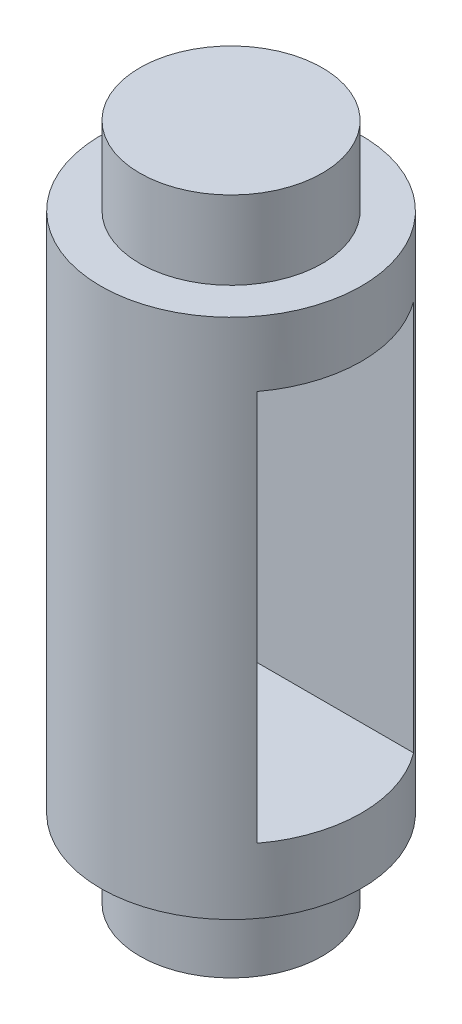
ISO-10303-21;
HEADER;
FILE_DESCRIPTION(('STEP AP214'),'2;1');
FILE_NAME('part.step','',(''),(''),'','','');
FILE_SCHEMA(('AUTOMOTIVE_DESIGN { 1 0 10303 214 1 1 1 1 }'));
ENDSEC;
DATA;
#1=APPLICATION_CONTEXT('core data for automotive mechanical design processes');
#2=APPLICATION_PROTOCOL_DEFINITION('international standard','automotive_design',2000,#1);
#3=PRODUCT_CONTEXT('',#1,'mechanical');
#4=PRODUCT('Part','Part','',(#3));
#5=PRODUCT_RELATED_PRODUCT_CATEGORY('part','',(#4));
#6=PRODUCT_DEFINITION_FORMATION('','',#4);
#7=PRODUCT_DEFINITION_CONTEXT('part definition',#1,'design');
#8=PRODUCT_DEFINITION('design','',#6,#7);
#9=PRODUCT_DEFINITION_SHAPE('','',#8);
#10=(LENGTH_UNIT() NAMED_UNIT(*) SI_UNIT(.MILLI.,.METRE.));
#11=(NAMED_UNIT(*) PLANE_ANGLE_UNIT() SI_UNIT($,.RADIAN.));
#12=(NAMED_UNIT(*) SI_UNIT($,.STERADIAN.) SOLID_ANGLE_UNIT());
#13=UNCERTAINTY_MEASURE_WITH_UNIT(LENGTH_MEASURE(1.E-05),#10,'distance_accuracy_value','');
#14=(GEOMETRIC_REPRESENTATION_CONTEXT(3) GLOBAL_UNCERTAINTY_ASSIGNED_CONTEXT((#13)) GLOBAL_UNIT_ASSIGNED_CONTEXT((#10,
#11,#12)) REPRESENTATION_CONTEXT('',''));
#15=CARTESIAN_POINT('',(0.,0.,0.));
#16=DIRECTION('',(0.,0.,1.));
#17=DIRECTION('',(1.,0.,0.));
#18=AXIS2_PLACEMENT_3D('',#15,#16,#17);
#19=CARTESIAN_POINT('',(0.,23.,0.));
#20=DIRECTION('',(0.,-1.,0.));
#21=DIRECTION('',(0.,0.,-1.));
#22=AXIS2_PLACEMENT_3D('',#19,#20,#21);
#23=CYLINDRICAL_SURFACE('',#22,5.);
#24=DIRECTION('',(0.,-1.,0.));
#25=VECTOR('',#24,1.);
#26=CARTESIAN_POINT('',(-4.,23.,3.));
#27=LINE('',#26,#25);
#28=CARTESIAN_POINT('',(-4.,5.5,3.));
#29=VERTEX_POINT('',#28);
#30=CARTESIAN_POINT('',(-4.,20.5,3.));
#31=VERTEX_POINT('',#30);
#32=EDGE_CURVE('E94',#29,#31,#27,.F.);
#33=ORIENTED_EDGE('',*,*,#32,.F.);
#34=CARTESIAN_POINT('',(0.,5.5,0.));
#35=DIRECTION('',(0.,1.,0.));
#36=DIRECTION('',(0.,0.,1.));
#37=AXIS2_PLACEMENT_3D('',#34,#35,#36);
#38=CIRCLE('',#37,5.);
#39=CARTESIAN_POINT('',(-4.,5.5,-3.));
#40=VERTEX_POINT('',#39);
#41=EDGE_CURVE('E92',#40,#29,#38,.T.);
#42=ORIENTED_EDGE('',*,*,#41,.F.);
#43=DIRECTION('',(0.,-1.,0.));
#44=VECTOR('',#43,1.);
#45=CARTESIAN_POINT('',(-4.,23.,-3.));
#46=LINE('',#45,#44);
#47=CARTESIAN_POINT('',(-4.,20.5,-3.));
#48=VERTEX_POINT('',#47);
#49=EDGE_CURVE('E77',#48,#40,#46,.T.);
#50=ORIENTED_EDGE('',*,*,#49,.F.);
#51=CARTESIAN_POINT('',(0.,20.5,0.));
#52=DIRECTION('',(0.,-1.,0.));
#53=DIRECTION('',(0.,0.,-1.));
#54=AXIS2_PLACEMENT_3D('',#51,#52,#53);
#55=CIRCLE('',#54,5.);
#56=EDGE_CURVE('E72',#31,#48,#55,.T.);
#57=ORIENTED_EDGE('',*,*,#56,.F.);
#58=EDGE_LOOP('',(#33,#42,#50,#57));
#59=FACE_BOUND('',#58,.T.);
#60=CARTESIAN_POINT('',(0.,23.,0.));
#61=DIRECTION('',(0.,1.,0.));
#62=DIRECTION('',(0.,0.,1.));
#63=AXIS2_PLACEMENT_3D('',#60,#61,#62);
#64=CIRCLE('',#63,5.);
#65=CARTESIAN_POINT('',(0.,23.,5.));
#66=VERTEX_POINT('',#65);
#67=EDGE_CURVE('E119',#66,#66,#64,.T.);
#68=ORIENTED_EDGE('',*,*,#67,.F.);
#69=EDGE_LOOP('',(#68));
#70=FACE_BOUND('',#69,.T.);
#71=CARTESIAN_POINT('',(0.,3.,0.));
#72=DIRECTION('',(0.,1.,0.));
#73=DIRECTION('',(0.,0.,1.));
#74=AXIS2_PLACEMENT_3D('',#71,#72,#73);
#75=CIRCLE('',#74,5.);
#76=CARTESIAN_POINT('',(0.,3.,5.));
#77=VERTEX_POINT('',#76);
#78=EDGE_CURVE('E115',#77,#77,#75,.T.);
#79=ORIENTED_EDGE('',*,*,#78,.T.);
#80=EDGE_LOOP('',(#79));
#81=FACE_BOUND('',#80,.T.);
#82=DIRECTION('',(0.,-1.,0.));
#83=VECTOR('',#82,1.);
#84=CARTESIAN_POINT('',(4.,23.,3.));
#85=LINE('',#84,#83);
#86=CARTESIAN_POINT('',(4.,20.5,3.));
#87=VERTEX_POINT('',#86);
#88=CARTESIAN_POINT('',(4.,5.5,3.));
#89=VERTEX_POINT('',#88);
#90=EDGE_CURVE('E11',#87,#89,#85,.T.);
#91=ORIENTED_EDGE('',*,*,#90,.F.);
#92=CARTESIAN_POINT('',(4.,20.5,-3.));
#93=VERTEX_POINT('',#92);
#94=EDGE_CURVE('E80',#93,#87,#55,.T.);
#95=ORIENTED_EDGE('',*,*,#94,.F.);
#96=DIRECTION('',(0.,-1.,0.));
#97=VECTOR('',#96,1.);
#98=CARTESIAN_POINT('',(4.,23.,-3.));
#99=LINE('',#98,#97);
#100=CARTESIAN_POINT('',(4.,5.5,-3.));
#101=VERTEX_POINT('',#100);
#102=EDGE_CURVE('E86',#101,#93,#99,.F.);
#103=ORIENTED_EDGE('',*,*,#102,.F.);
#104=EDGE_CURVE('E43',#89,#101,#38,.T.);
#105=ORIENTED_EDGE('',*,*,#104,.F.);
#106=EDGE_LOOP('',(#91,#95,#103,#105));
#107=FACE_BOUND('',#106,.T.);
#108=ADVANCED_FACE('F35',(#59,#70,#81,#107),#23,.T.);
#109=CARTESIAN_POINT('',(0.,3.,0.));
#110=DIRECTION('',(0.,-1.,0.));
#111=DIRECTION('',(0.,0.,-1.));
#112=AXIS2_PLACEMENT_3D('',#109,#110,#111);
#113=CYLINDRICAL_SURFACE('',#112,3.5);
#114=CARTESIAN_POINT('',(0.,3.,0.));
#115=DIRECTION('',(0.,1.,0.));
#116=DIRECTION('',(0.,0.,1.));
#117=AXIS2_PLACEMENT_3D('',#114,#115,#116);
#118=CIRCLE('',#117,3.5);
#119=CARTESIAN_POINT('',(0.,3.,3.5));
#120=VERTEX_POINT('',#119);
#121=EDGE_CURVE('E118',#120,#120,#118,.T.);
#122=ORIENTED_EDGE('',*,*,#121,.F.);
#123=EDGE_LOOP('',(#122));
#124=FACE_BOUND('',#123,.T.);
#125=CARTESIAN_POINT('',(0.,0.,0.));
#126=DIRECTION('',(0.,1.,0.));
#127=DIRECTION('',(0.,0.,1.));
#128=AXIS2_PLACEMENT_3D('',#125,#126,#127);
#129=CIRCLE('',#128,3.5);
#130=CARTESIAN_POINT('',(0.,0.,3.5));
#131=VERTEX_POINT('',#130);
#132=EDGE_CURVE('E122',#131,#131,#129,.T.);
#133=ORIENTED_EDGE('',*,*,#132,.T.);
#134=EDGE_LOOP('',(#133));
#135=FACE_BOUND('',#134,.T.);
#136=ADVANCED_FACE('F37',(#124,#135),#113,.T.);
#137=CARTESIAN_POINT('',(0.,0.,0.));
#138=DIRECTION('',(0.,1.,0.));
#139=DIRECTION('',(0.,0.,1.));
#140=AXIS2_PLACEMENT_3D('',#137,#138,#139);
#141=PLANE('',#140);
#142=ORIENTED_EDGE('',*,*,#132,.F.);
#143=EDGE_LOOP('',(#142));
#144=FACE_BOUND('',#143,.T.);
#145=ADVANCED_FACE('F130',(#144),#141,.F.);
#146=CARTESIAN_POINT('',(0.,23.,0.));
#147=DIRECTION('',(0.,1.,0.));
#148=DIRECTION('',(0.,0.,1.));
#149=AXIS2_PLACEMENT_3D('',#146,#147,#148);
#150=PLANE('',#149);
#151=CARTESIAN_POINT('',(0.,23.,0.));
#152=DIRECTION('',(0.,1.,0.));
#153=DIRECTION('',(0.,0.,1.));
#154=AXIS2_PLACEMENT_3D('',#151,#152,#153);
#155=CIRCLE('',#154,3.5);
#156=CARTESIAN_POINT('',(0.,23.,3.5));
#157=VERTEX_POINT('',#156);
#158=EDGE_CURVE('E78',#157,#157,#155,.T.);
#159=ORIENTED_EDGE('',*,*,#158,.F.);
#160=EDGE_LOOP('',(#159));
#161=FACE_BOUND('',#160,.T.);
#162=ORIENTED_EDGE('',*,*,#67,.T.);
#163=EDGE_LOOP('',(#162));
#164=FACE_BOUND('',#163,.T.);
#165=ADVANCED_FACE('F132',(#161,#164),#150,.T.);
#166=CARTESIAN_POINT('',(0.,3.,0.));
#167=DIRECTION('',(0.,1.,0.));
#168=DIRECTION('',(0.,0.,1.));
#169=AXIS2_PLACEMENT_3D('',#166,#167,#168);
#170=PLANE('',#169);
#171=ORIENTED_EDGE('',*,*,#121,.T.);
#172=EDGE_LOOP('',(#171));
#173=FACE_BOUND('',#172,.T.);
#174=ORIENTED_EDGE('',*,*,#78,.F.);
#175=EDGE_LOOP('',(#174));
#176=FACE_BOUND('',#175,.T.);
#177=ADVANCED_FACE('F137',(#173,#176),#170,.F.);
#178=CARTESIAN_POINT('',(0.,26.,0.));
#179=DIRECTION('',(0.,-1.,0.));
#180=DIRECTION('',(0.,0.,-1.));
#181=AXIS2_PLACEMENT_3D('',#178,#179,#180);
#182=CYLINDRICAL_SURFACE('',#181,3.5);
#183=CARTESIAN_POINT('',(0.,26.,0.));
#184=DIRECTION('',(0.,1.,0.));
#185=DIRECTION('',(0.,0.,1.));
#186=AXIS2_PLACEMENT_3D('',#183,#184,#185);
#187=CIRCLE('',#186,3.5);
#188=CARTESIAN_POINT('',(0.,26.,3.5));
#189=VERTEX_POINT('',#188);
#190=EDGE_CURVE('E110',#189,#189,#187,.T.);
#191=ORIENTED_EDGE('',*,*,#190,.F.);
#192=EDGE_LOOP('',(#191));
#193=FACE_BOUND('',#192,.T.);
#194=ORIENTED_EDGE('',*,*,#158,.T.);
#195=EDGE_LOOP('',(#194));
#196=FACE_BOUND('',#195,.T.);
#197=ADVANCED_FACE('F147',(#193,#196),#182,.T.);
#198=CARTESIAN_POINT('',(0.,26.,0.));
#199=DIRECTION('',(0.,1.,0.));
#200=DIRECTION('',(0.,0.,1.));
#201=AXIS2_PLACEMENT_3D('',#198,#199,#200);
#202=PLANE('',#201);
#203=ORIENTED_EDGE('',*,*,#190,.T.);
#204=EDGE_LOOP('',(#203));
#205=FACE_BOUND('',#204,.T.);
#206=ADVANCED_FACE('F152',(#205),#202,.T.);
#207=CARTESIAN_POINT('',(10.,20.5,3.));
#208=DIRECTION('',(0.,0.,-1.));
#209=DIRECTION('',(0.,1.,0.));
#210=AXIS2_PLACEMENT_3D('',#207,#208,#209);
#211=PLANE('',#210);
#212=ORIENTED_EDGE('',*,*,#90,.T.);
#213=DIRECTION('',(-1.,0.,0.));
#214=VECTOR('',#213,1.);
#215=CARTESIAN_POINT('',(10.,5.5,3.));
#216=LINE('',#215,#214);
#217=EDGE_CURVE('E108',#89,#29,#216,.T.);
#218=ORIENTED_EDGE('',*,*,#217,.T.);
#219=ORIENTED_EDGE('',*,*,#32,.T.);
#220=DIRECTION('',(-1.,0.,0.));
#221=VECTOR('',#220,1.);
#222=CARTESIAN_POINT('',(10.,20.5,3.));
#223=LINE('',#222,#221);
#224=EDGE_CURVE('E55',#87,#31,#223,.T.);
#225=ORIENTED_EDGE('',*,*,#224,.F.);
#226=EDGE_LOOP('',(#212,#218,#219,#225));
#227=FACE_BOUND('',#226,.T.);
#228=ADVANCED_FACE('F101',(#227),#211,.T.);
#229=CARTESIAN_POINT('',(10.,5.5,3.));
#230=DIRECTION('',(0.,1.,0.));
#231=DIRECTION('',(0.,0.,1.));
#232=AXIS2_PLACEMENT_3D('',#229,#230,#231);
#233=PLANE('',#232);
#234=ORIENTED_EDGE('',*,*,#104,.T.);
#235=DIRECTION('',(-1.,0.,0.));
#236=VECTOR('',#235,1.);
#237=CARTESIAN_POINT('',(10.,5.5,-3.));
#238=LINE('',#237,#236);
#239=EDGE_CURVE('E88',#101,#40,#238,.T.);
#240=ORIENTED_EDGE('',*,*,#239,.T.);
#241=ORIENTED_EDGE('',*,*,#41,.T.);
#242=ORIENTED_EDGE('',*,*,#217,.F.);
#243=EDGE_LOOP('',(#234,#240,#241,#242));
#244=FACE_BOUND('',#243,.T.);
#245=ADVANCED_FACE('F107',(#244),#233,.T.);
#246=CARTESIAN_POINT('',(10.,20.5,-3.));
#247=DIRECTION('',(0.,0.,1.));
#248=DIRECTION('',(0.,-1.,0.));
#249=AXIS2_PLACEMENT_3D('',#246,#247,#248);
#250=PLANE('',#249);
#251=ORIENTED_EDGE('',*,*,#49,.T.);
#252=ORIENTED_EDGE('',*,*,#239,.F.);
#253=ORIENTED_EDGE('',*,*,#102,.T.);
#254=DIRECTION('',(-1.,0.,0.));
#255=VECTOR('',#254,1.);
#256=CARTESIAN_POINT('',(10.,20.5,-3.));
#257=LINE('',#256,#255);
#258=EDGE_CURVE('E50',#93,#48,#257,.T.);
#259=ORIENTED_EDGE('',*,*,#258,.T.);
#260=EDGE_LOOP('',(#251,#252,#253,#259));
#261=FACE_BOUND('',#260,.T.);
#262=ADVANCED_FACE('F82',(#261),#250,.T.);
#263=CARTESIAN_POINT('',(10.,20.5,3.));
#264=DIRECTION('',(0.,-1.,0.));
#265=DIRECTION('',(0.,0.,-1.));
#266=AXIS2_PLACEMENT_3D('',#263,#264,#265);
#267=PLANE('',#266);
#268=ORIENTED_EDGE('',*,*,#94,.T.);
#269=ORIENTED_EDGE('',*,*,#224,.T.);
#270=ORIENTED_EDGE('',*,*,#56,.T.);
#271=ORIENTED_EDGE('',*,*,#258,.F.);
#272=EDGE_LOOP('',(#268,#269,#270,#271));
#273=FACE_BOUND('',#272,.T.);
#274=ADVANCED_FACE('F73',(#273),#267,.T.);
#275=CLOSED_SHELL('',(#108,#136,#145,#165,#177,#197,#206,#228,#245,#262,#274));
#276=MANIFOLD_SOLID_BREP('B2',#275);
#277=ADVANCED_BREP_SHAPE_REPRESENTATION('',(#18,#276),#14);
#278=SHAPE_DEFINITION_REPRESENTATION(#9,#277);
ENDSEC;
END-ISO-10303-21;
